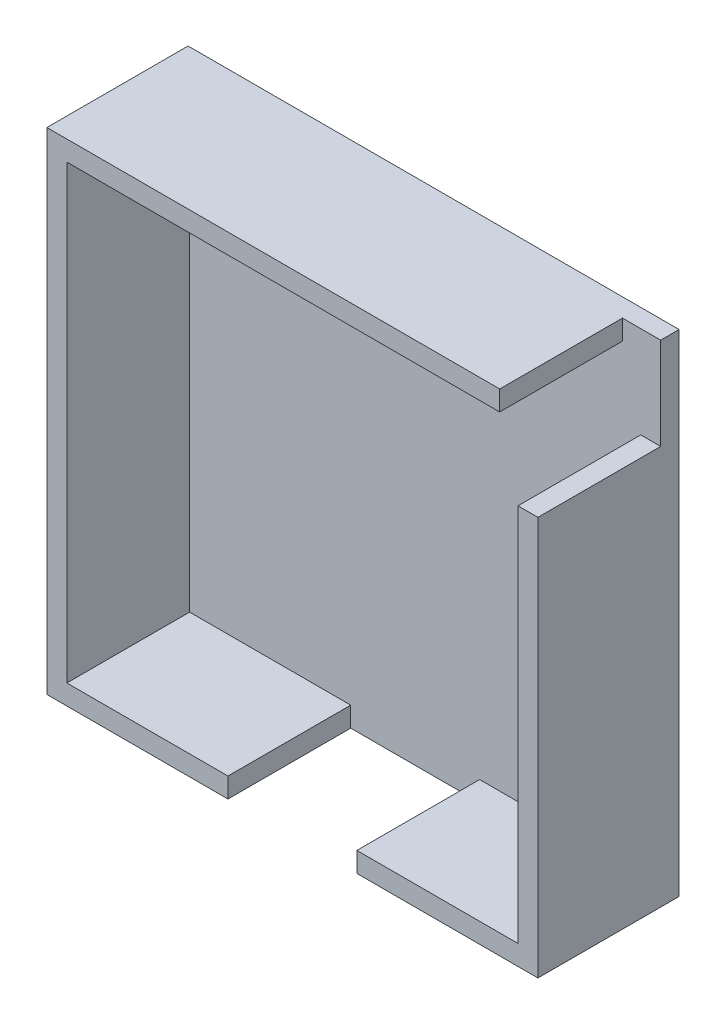
ISO-10303-21;
HEADER;
FILE_DESCRIPTION(('STEP AP214'),'2;1');
FILE_NAME('part.step','',(''),(''),'','','');
FILE_SCHEMA(('AUTOMOTIVE_DESIGN { 1 0 10303 214 1 1 1 1 }'));
ENDSEC;
DATA;
#1=APPLICATION_CONTEXT('core data for automotive mechanical design processes');
#2=APPLICATION_PROTOCOL_DEFINITION('international standard','automotive_design',2000,#1);
#3=PRODUCT_CONTEXT('',#1,'mechanical');
#4=PRODUCT('Part','Part','',(#3));
#5=PRODUCT_RELATED_PRODUCT_CATEGORY('part','',(#4));
#6=PRODUCT_DEFINITION_FORMATION('','',#4);
#7=PRODUCT_DEFINITION_CONTEXT('part definition',#1,'design');
#8=PRODUCT_DEFINITION('design','',#6,#7);
#9=PRODUCT_DEFINITION_SHAPE('','',#8);
#10=(LENGTH_UNIT() NAMED_UNIT(*) SI_UNIT(.MILLI.,.METRE.));
#11=(NAMED_UNIT(*) PLANE_ANGLE_UNIT() SI_UNIT($,.RADIAN.));
#12=(NAMED_UNIT(*) SI_UNIT($,.STERADIAN.) SOLID_ANGLE_UNIT());
#13=UNCERTAINTY_MEASURE_WITH_UNIT(LENGTH_MEASURE(1.E-05),#10,'distance_accuracy_value','');
#14=(GEOMETRIC_REPRESENTATION_CONTEXT(3) GLOBAL_UNCERTAINTY_ASSIGNED_CONTEXT((#13)) GLOBAL_UNIT_ASSIGNED_CONTEXT((#10,
#11,#12)) REPRESENTATION_CONTEXT('',''));
#15=CARTESIAN_POINT('',(0.,0.,0.));
#16=DIRECTION('',(0.,0.,1.));
#17=DIRECTION('',(1.,0.,0.));
#18=AXIS2_PLACEMENT_3D('',#15,#16,#17);
#19=CARTESIAN_POINT('',(0.,-40.,3.));
#20=DIRECTION('',(0.,-1.,0.));
#21=DIRECTION('',(1.,0.,0.));
#22=AXIS2_PLACEMENT_3D('',#19,#20,#21);
#23=PLANE('',#22);
#24=DIRECTION('',(-1.,0.,0.));
#25=VECTOR('',#24,1.);
#26=CARTESIAN_POINT('',(0.,-40.,0.));
#27=LINE('',#26,#25);
#28=CARTESIAN_POINT('',(40.,-40.,0.));
#29=VERTEX_POINT('',#28);
#30=CARTESIAN_POINT('',(-40.,-40.,0.));
#31=VERTEX_POINT('',#30);
#32=EDGE_CURVE('E268',#29,#31,#27,.T.);
#33=ORIENTED_EDGE('',*,*,#32,.F.);
#34=DIRECTION('',(0.,0.,-1.));
#35=VECTOR('',#34,1.);
#36=CARTESIAN_POINT('',(40.,-40.,3.));
#37=LINE('',#36,#35);
#38=CARTESIAN_POINT('',(40.,-40.,23.));
#39=VERTEX_POINT('',#38);
#40=EDGE_CURVE('E10',#39,#29,#37,.T.);
#41=ORIENTED_EDGE('',*,*,#40,.F.);
#42=DIRECTION('',(-1.,0.,0.));
#43=VECTOR('',#42,1.);
#44=CARTESIAN_POINT('',(0.,-40.,23.));
#45=LINE('',#44,#43);
#46=CARTESIAN_POINT('',(10.5,-40.,23.));
#47=VERTEX_POINT('',#46);
#48=EDGE_CURVE('E182',#39,#47,#45,.T.);
#49=ORIENTED_EDGE('',*,*,#48,.T.);
#50=DIRECTION('',(0.,0.,-1.));
#51=VECTOR('',#50,1.);
#52=CARTESIAN_POINT('',(10.5,-40.,23.));
#53=LINE('',#52,#51);
#54=CARTESIAN_POINT('',(10.5,-40.,3.));
#55=VERTEX_POINT('',#54);
#56=EDGE_CURVE('E167',#47,#55,#53,.T.);
#57=ORIENTED_EDGE('',*,*,#56,.T.);
#58=DIRECTION('',(-1.,0.,0.));
#59=VECTOR('',#58,1.);
#60=CARTESIAN_POINT('',(0.,-40.,3.));
#61=LINE('',#60,#59);
#62=CARTESIAN_POINT('',(-10.5,-40.,3.));
#63=VERTEX_POINT('',#62);
#64=EDGE_CURVE('E288',#55,#63,#61,.T.);
#65=ORIENTED_EDGE('',*,*,#64,.T.);
#66=DIRECTION('',(0.,0.,-1.));
#67=VECTOR('',#66,1.);
#68=CARTESIAN_POINT('',(-10.5,-40.,23.));
#69=LINE('',#68,#67);
#70=CARTESIAN_POINT('',(-10.5,-40.,23.));
#71=VERTEX_POINT('',#70);
#72=EDGE_CURVE('E281',#71,#63,#69,.T.);
#73=ORIENTED_EDGE('',*,*,#72,.F.);
#74=DIRECTION('',(-1.,0.,0.));
#75=VECTOR('',#74,1.);
#76=CARTESIAN_POINT('',(0.,-40.,23.));
#77=LINE('',#76,#75);
#78=CARTESIAN_POINT('',(-40.,-40.,23.));
#79=VERTEX_POINT('',#78);
#80=EDGE_CURVE('E220',#71,#79,#77,.T.);
#81=ORIENTED_EDGE('',*,*,#80,.T.);
#82=DIRECTION('',(0.,0.,-1.));
#83=VECTOR('',#82,1.);
#84=CARTESIAN_POINT('',(-40.,-40.,3.));
#85=LINE('',#84,#83);
#86=EDGE_CURVE('E298',#79,#31,#85,.T.);
#87=ORIENTED_EDGE('',*,*,#86,.T.);
#88=EDGE_LOOP('',(#33,#41,#49,#57,#65,#73,#81,#87));
#89=FACE_BOUND('',#88,.T.);
#90=ADVANCED_FACE('F16',(#89),#23,.T.);
#91=CARTESIAN_POINT('',(40.,-0.225990481713403,3.));
#92=DIRECTION('',(-1.,0.,0.));
#93=DIRECTION('',(0.,-1.,0.));
#94=AXIS2_PLACEMENT_3D('',#91,#92,#93);
#95=PLANE('',#94);
#96=DIRECTION('',(0.,1.,0.));
#97=VECTOR('',#96,1.);
#98=CARTESIAN_POINT('',(40.,-0.225990481713403,0.));
#99=LINE('',#98,#97);
#100=CARTESIAN_POINT('',(40.,40.,0.));
#101=VERTEX_POINT('',#100);
#102=EDGE_CURVE('E302',#29,#101,#99,.T.);
#103=ORIENTED_EDGE('',*,*,#102,.T.);
#104=DIRECTION('',(0.,0.,-1.));
#105=VECTOR('',#104,1.);
#106=CARTESIAN_POINT('',(40.,40.,3.));
#107=LINE('',#106,#105);
#108=CARTESIAN_POINT('',(40.,40.,3.));
#109=VERTEX_POINT('',#108);
#110=EDGE_CURVE('E24',#109,#101,#107,.T.);
#111=ORIENTED_EDGE('',*,*,#110,.F.);
#112=DIRECTION('',(0.,1.,0.));
#113=VECTOR('',#112,1.);
#114=CARTESIAN_POINT('',(40.,-0.225990481713403,3.));
#115=LINE('',#114,#113);
#116=CARTESIAN_POINT('',(40.,25.,3.));
#117=VERTEX_POINT('',#116);
#118=EDGE_CURVE('E291',#117,#109,#115,.T.);
#119=ORIENTED_EDGE('',*,*,#118,.F.);
#120=DIRECTION('',(0.,0.,-1.));
#121=VECTOR('',#120,1.);
#122=CARTESIAN_POINT('',(40.,25.,23.));
#123=LINE('',#122,#121);
#124=CARTESIAN_POINT('',(40.,25.,23.));
#125=VERTEX_POINT('',#124);
#126=EDGE_CURVE('E211',#125,#117,#123,.T.);
#127=ORIENTED_EDGE('',*,*,#126,.F.);
#128=DIRECTION('',(0.,1.,0.));
#129=VECTOR('',#128,1.);
#130=CARTESIAN_POINT('',(40.,-0.225990481713403,23.));
#131=LINE('',#130,#129);
#132=EDGE_CURVE('E187',#39,#125,#131,.T.);
#133=ORIENTED_EDGE('',*,*,#132,.F.);
#134=ORIENTED_EDGE('',*,*,#40,.T.);
#135=EDGE_LOOP('',(#103,#111,#119,#127,#133,#134));
#136=FACE_BOUND('',#135,.T.);
#137=ADVANCED_FACE('F347',(#136),#95,.F.);
#138=CARTESIAN_POINT('',(0.,40.,3.));
#139=DIRECTION('',(0.,-1.,0.));
#140=DIRECTION('',(1.,0.,0.));
#141=AXIS2_PLACEMENT_3D('',#138,#139,#140);
#142=PLANE('',#141);
#143=DIRECTION('',(-1.,0.,0.));
#144=VECTOR('',#143,1.);
#145=CARTESIAN_POINT('',(0.,40.,0.));
#146=LINE('',#145,#144);
#147=CARTESIAN_POINT('',(-40.,40.,0.));
#148=VERTEX_POINT('',#147);
#149=EDGE_CURVE('E305',#101,#148,#146,.T.);
#150=ORIENTED_EDGE('',*,*,#149,.T.);
#151=DIRECTION('',(0.,0.,-1.));
#152=VECTOR('',#151,1.);
#153=CARTESIAN_POINT('',(-40.,40.,3.));
#154=LINE('',#153,#152);
#155=CARTESIAN_POINT('',(-40.,40.,23.));
#156=VERTEX_POINT('',#155);
#157=EDGE_CURVE('E314',#156,#148,#154,.T.);
#158=ORIENTED_EDGE('',*,*,#157,.F.);
#159=DIRECTION('',(-1.,0.,0.));
#160=VECTOR('',#159,1.);
#161=CARTESIAN_POINT('',(0.,40.,23.));
#162=LINE('',#161,#160);
#163=CARTESIAN_POINT('',(33.7766595184803,40.,23.));
#164=VERTEX_POINT('',#163);
#165=EDGE_CURVE('E226',#164,#156,#162,.T.);
#166=ORIENTED_EDGE('',*,*,#165,.F.);
#167=DIRECTION('',(0.,0.,-1.));
#168=VECTOR('',#167,1.);
#169=CARTESIAN_POINT('',(33.7766595184803,40.,23.));
#170=LINE('',#169,#168);
#171=CARTESIAN_POINT('',(33.7766595184803,40.,3.));
#172=VERTEX_POINT('',#171);
#173=EDGE_CURVE('E277',#164,#172,#170,.T.);
#174=ORIENTED_EDGE('',*,*,#173,.T.);
#175=DIRECTION('',(-1.,0.,0.));
#176=VECTOR('',#175,1.);
#177=CARTESIAN_POINT('',(0.,40.,3.));
#178=LINE('',#177,#176);
#179=EDGE_CURVE('E295',#109,#172,#178,.T.);
#180=ORIENTED_EDGE('',*,*,#179,.F.);
#181=ORIENTED_EDGE('',*,*,#110,.T.);
#182=EDGE_LOOP('',(#150,#158,#166,#174,#180,#181));
#183=FACE_BOUND('',#182,.T.);
#184=ADVANCED_FACE('F323',(#183),#142,.F.);
#185=CARTESIAN_POINT('',(-40.,-0.225990481713413,3.));
#186=DIRECTION('',(-1.,0.,0.));
#187=DIRECTION('',(0.,-1.,0.));
#188=AXIS2_PLACEMENT_3D('',#185,#186,#187);
#189=PLANE('',#188);
#190=DIRECTION('',(0.,1.,0.));
#191=VECTOR('',#190,1.);
#192=CARTESIAN_POINT('',(-40.,-0.225990481713413,0.));
#193=LINE('',#192,#191);
#194=EDGE_CURVE('E292',#31,#148,#193,.T.);
#195=ORIENTED_EDGE('',*,*,#194,.F.);
#196=ORIENTED_EDGE('',*,*,#86,.F.);
#197=DIRECTION('',(0.,1.,0.));
#198=VECTOR('',#197,1.);
#199=CARTESIAN_POINT('',(-40.,-0.225990481713413,23.));
#200=LINE('',#199,#198);
#201=EDGE_CURVE('E222',#79,#156,#200,.T.);
#202=ORIENTED_EDGE('',*,*,#201,.T.);
#203=ORIENTED_EDGE('',*,*,#157,.T.);
#204=EDGE_LOOP('',(#195,#196,#202,#203));
#205=FACE_BOUND('',#204,.T.);
#206=ADVANCED_FACE('F332',(#205),#189,.T.);
#207=CARTESIAN_POINT('',(0.,0.,3.));
#208=DIRECTION('',(0.,0.,1.));
#209=DIRECTION('',(1.,0.,0.));
#210=AXIS2_PLACEMENT_3D('',#207,#208,#209);
#211=PLANE('',#210);
#212=DIRECTION('',(-1.,0.,0.));
#213=VECTOR('',#212,1.);
#214=CARTESIAN_POINT('',(36.8883297592402,25.,3.));
#215=LINE('',#214,#213);
#216=CARTESIAN_POINT('',(36.75,25.,3.));
#217=VERTEX_POINT('',#216);
#218=EDGE_CURVE('E201',#117,#217,#215,.T.);
#219=ORIENTED_EDGE('',*,*,#218,.F.);
#220=ORIENTED_EDGE('',*,*,#118,.T.);
#221=ORIENTED_EDGE('',*,*,#179,.T.);
#222=DIRECTION('',(0.,-1.,0.));
#223=VECTOR('',#222,1.);
#224=CARTESIAN_POINT('',(33.7766595184803,33.8033168390393,3.));
#225=LINE('',#224,#223);
#226=CARTESIAN_POINT('',(33.7766595184803,36.75,3.));
#227=VERTEX_POINT('',#226);
#228=EDGE_CURVE('E251',#172,#227,#225,.T.);
#229=ORIENTED_EDGE('',*,*,#228,.T.);
#230=DIRECTION('',(1.,0.,0.));
#231=VECTOR('',#230,1.);
#232=CARTESIAN_POINT('',(0.,36.75,3.));
#233=LINE('',#232,#231);
#234=CARTESIAN_POINT('',(-36.75,36.75,3.));
#235=VERTEX_POINT('',#234);
#236=EDGE_CURVE('E254',#235,#227,#233,.T.);
#237=ORIENTED_EDGE('',*,*,#236,.F.);
#238=DIRECTION('',(0.,1.,0.));
#239=VECTOR('',#238,1.);
#240=CARTESIAN_POINT('',(-36.75,-2.72999827521185,3.));
#241=LINE('',#240,#239);
#242=CARTESIAN_POINT('',(-36.75,-36.75,3.));
#243=VERTEX_POINT('',#242);
#244=EDGE_CURVE('E258',#243,#235,#241,.T.);
#245=ORIENTED_EDGE('',*,*,#244,.F.);
#246=DIRECTION('',(1.,0.,0.));
#247=VECTOR('',#246,1.);
#248=CARTESIAN_POINT('',(0.,-36.75,3.));
#249=LINE('',#248,#247);
#250=CARTESIAN_POINT('',(-10.5,-36.75,3.));
#251=VERTEX_POINT('',#250);
#252=EDGE_CURVE('E221',#243,#251,#249,.T.);
#253=ORIENTED_EDGE('',*,*,#252,.T.);
#254=DIRECTION('',(0.,1.,0.));
#255=VECTOR('',#254,1.);
#256=CARTESIAN_POINT('',(-10.5,-36.75,3.));
#257=LINE('',#256,#255);
#258=EDGE_CURVE('E166',#63,#251,#257,.T.);
#259=ORIENTED_EDGE('',*,*,#258,.F.);
#260=ORIENTED_EDGE('',*,*,#64,.F.);
#261=DIRECTION('',(0.,1.,0.));
#262=VECTOR('',#261,1.);
#263=CARTESIAN_POINT('',(10.5,-36.75,3.));
#264=LINE('',#263,#262);
#265=CARTESIAN_POINT('',(10.5,-36.75,3.));
#266=VERTEX_POINT('',#265);
#267=EDGE_CURVE('E36',#55,#266,#264,.T.);
#268=ORIENTED_EDGE('',*,*,#267,.T.);
#269=DIRECTION('',(1.,0.,0.));
#270=VECTOR('',#269,1.);
#271=CARTESIAN_POINT('',(0.,-36.75,3.));
#272=LINE('',#271,#270);
#273=CARTESIAN_POINT('',(36.75,-36.75,3.));
#274=VERTEX_POINT('',#273);
#275=EDGE_CURVE('E162',#266,#274,#272,.T.);
#276=ORIENTED_EDGE('',*,*,#275,.T.);
#277=DIRECTION('',(0.,1.,0.));
#278=VECTOR('',#277,1.);
#279=CARTESIAN_POINT('',(36.75,-2.72999827521185,3.));
#280=LINE('',#279,#278);
#281=EDGE_CURVE('E44',#274,#217,#280,.T.);
#282=ORIENTED_EDGE('',*,*,#281,.T.);
#283=EDGE_LOOP('',(#219,#220,#221,#229,#237,#245,#253,#259,#260,#268,#276,#282));
#284=FACE_BOUND('',#283,.T.);
#285=ADVANCED_FACE('F345',(#284),#211,.T.);
#286=CARTESIAN_POINT('',(0.,0.,0.));
#287=DIRECTION('',(0.,0.,1.));
#288=DIRECTION('',(1.,0.,0.));
#289=AXIS2_PLACEMENT_3D('',#286,#287,#288);
#290=PLANE('',#289);
#291=ORIENTED_EDGE('',*,*,#32,.T.);
#292=ORIENTED_EDGE('',*,*,#194,.T.);
#293=ORIENTED_EDGE('',*,*,#149,.F.);
#294=ORIENTED_EDGE('',*,*,#102,.F.);
#295=EDGE_LOOP('',(#291,#292,#293,#294));
#296=FACE_BOUND('',#295,.T.);
#297=ADVANCED_FACE('F328',(#296),#290,.F.);
#298=CARTESIAN_POINT('',(0.,-36.75,23.));
#299=DIRECTION('',(0.,1.,0.));
#300=DIRECTION('',(0.,0.,1.));
#301=AXIS2_PLACEMENT_3D('',#298,#299,#300);
#302=PLANE('',#301);
#303=ORIENTED_EDGE('',*,*,#252,.F.);
#304=DIRECTION('',(0.,0.,-1.));
#305=VECTOR('',#304,1.);
#306=CARTESIAN_POINT('',(-36.75,-36.75,23.));
#307=LINE('',#306,#305);
#308=CARTESIAN_POINT('',(-36.75,-36.75,23.));
#309=VERTEX_POINT('',#308);
#310=EDGE_CURVE('E264',#309,#243,#307,.T.);
#311=ORIENTED_EDGE('',*,*,#310,.F.);
#312=DIRECTION('',(1.,0.,0.));
#313=VECTOR('',#312,1.);
#314=CARTESIAN_POINT('',(0.,-36.75,23.));
#315=LINE('',#314,#313);
#316=CARTESIAN_POINT('',(-10.5,-36.75,23.));
#317=VERTEX_POINT('',#316);
#318=EDGE_CURVE('E240',#309,#317,#315,.T.);
#319=ORIENTED_EDGE('',*,*,#318,.T.);
#320=DIRECTION('',(0.,0.,-1.));
#321=VECTOR('',#320,1.);
#322=CARTESIAN_POINT('',(-10.5,-36.75,23.));
#323=LINE('',#322,#321);
#324=EDGE_CURVE('E247',#317,#251,#323,.T.);
#325=ORIENTED_EDGE('',*,*,#324,.T.);
#326=EDGE_LOOP('',(#303,#311,#319,#325));
#327=FACE_BOUND('',#326,.T.);
#328=ADVANCED_FACE('F361',(#327),#302,.T.);
#329=CARTESIAN_POINT('',(-36.75,-2.72999827521185,23.));
#330=DIRECTION('',(-1.,0.,0.));
#331=DIRECTION('',(0.,-1.,0.));
#332=AXIS2_PLACEMENT_3D('',#329,#330,#331);
#333=PLANE('',#332);
#334=ORIENTED_EDGE('',*,*,#244,.T.);
#335=DIRECTION('',(0.,0.,-1.));
#336=VECTOR('',#335,1.);
#337=CARTESIAN_POINT('',(-36.75,36.75,23.));
#338=LINE('',#337,#336);
#339=CARTESIAN_POINT('',(-36.75,36.75,23.));
#340=VERTEX_POINT('',#339);
#341=EDGE_CURVE('E269',#340,#235,#338,.T.);
#342=ORIENTED_EDGE('',*,*,#341,.F.);
#343=DIRECTION('',(0.,1.,0.));
#344=VECTOR('',#343,1.);
#345=CARTESIAN_POINT('',(-36.75,-2.72999827521185,23.));
#346=LINE('',#345,#344);
#347=EDGE_CURVE('E237',#309,#340,#346,.T.);
#348=ORIENTED_EDGE('',*,*,#347,.F.);
#349=ORIENTED_EDGE('',*,*,#310,.T.);
#350=EDGE_LOOP('',(#334,#342,#348,#349));
#351=FACE_BOUND('',#350,.T.);
#352=ADVANCED_FACE('F365',(#351),#333,.F.);
#353=CARTESIAN_POINT('',(0.,36.75,23.));
#354=DIRECTION('',(0.,1.,0.));
#355=DIRECTION('',(0.,0.,1.));
#356=AXIS2_PLACEMENT_3D('',#353,#354,#355);
#357=PLANE('',#356);
#358=ORIENTED_EDGE('',*,*,#236,.T.);
#359=DIRECTION('',(0.,0.,-1.));
#360=VECTOR('',#359,1.);
#361=CARTESIAN_POINT('',(33.7766595184803,36.75,23.));
#362=LINE('',#361,#360);
#363=CARTESIAN_POINT('',(33.7766595184803,36.75,23.));
#364=VERTEX_POINT('',#363);
#365=EDGE_CURVE('E273',#364,#227,#362,.T.);
#366=ORIENTED_EDGE('',*,*,#365,.F.);
#367=DIRECTION('',(1.,0.,0.));
#368=VECTOR('',#367,1.);
#369=CARTESIAN_POINT('',(0.,36.75,23.));
#370=LINE('',#369,#368);
#371=EDGE_CURVE('E234',#340,#364,#370,.T.);
#372=ORIENTED_EDGE('',*,*,#371,.F.);
#373=ORIENTED_EDGE('',*,*,#341,.T.);
#374=EDGE_LOOP('',(#358,#366,#372,#373));
#375=FACE_BOUND('',#374,.T.);
#376=ADVANCED_FACE('F367',(#375),#357,.F.);
#377=CARTESIAN_POINT('',(33.7766595184803,33.8033168390393,23.));
#378=DIRECTION('',(1.,0.,0.));
#379=DIRECTION('',(0.,1.,0.));
#380=AXIS2_PLACEMENT_3D('',#377,#378,#379);
#381=PLANE('',#380);
#382=ORIENTED_EDGE('',*,*,#228,.F.);
#383=ORIENTED_EDGE('',*,*,#173,.F.);
#384=DIRECTION('',(0.,-1.,0.));
#385=VECTOR('',#384,1.);
#386=CARTESIAN_POINT('',(33.7766595184803,33.8033168390393,23.));
#387=LINE('',#386,#385);
#388=EDGE_CURVE('E230',#164,#364,#387,.T.);
#389=ORIENTED_EDGE('',*,*,#388,.T.);
#390=ORIENTED_EDGE('',*,*,#365,.T.);
#391=EDGE_LOOP('',(#382,#383,#389,#390));
#392=FACE_BOUND('',#391,.T.);
#393=ADVANCED_FACE('F344',(#392),#381,.T.);
#394=CARTESIAN_POINT('',(-10.5,-36.75,23.));
#395=DIRECTION('',(-1.,0.,0.));
#396=DIRECTION('',(0.,-1.,0.));
#397=AXIS2_PLACEMENT_3D('',#394,#395,#396);
#398=PLANE('',#397);
#399=ORIENTED_EDGE('',*,*,#258,.T.);
#400=ORIENTED_EDGE('',*,*,#324,.F.);
#401=DIRECTION('',(0.,1.,0.));
#402=VECTOR('',#401,1.);
#403=CARTESIAN_POINT('',(-10.5,-36.75,23.));
#404=LINE('',#403,#402);
#405=EDGE_CURVE('E217',#71,#317,#404,.T.);
#406=ORIENTED_EDGE('',*,*,#405,.F.);
#407=ORIENTED_EDGE('',*,*,#72,.T.);
#408=EDGE_LOOP('',(#399,#400,#406,#407));
#409=FACE_BOUND('',#408,.T.);
#410=ADVANCED_FACE('F357',(#409),#398,.F.);
#411=CARTESIAN_POINT('',(0.,0.,23.));
#412=DIRECTION('',(0.,0.,1.));
#413=DIRECTION('',(1.,0.,0.));
#414=AXIS2_PLACEMENT_3D('',#411,#412,#413);
#415=PLANE('',#414);
#416=ORIENTED_EDGE('',*,*,#318,.F.);
#417=ORIENTED_EDGE('',*,*,#347,.T.);
#418=ORIENTED_EDGE('',*,*,#371,.T.);
#419=ORIENTED_EDGE('',*,*,#388,.F.);
#420=ORIENTED_EDGE('',*,*,#165,.T.);
#421=ORIENTED_EDGE('',*,*,#201,.F.);
#422=ORIENTED_EDGE('',*,*,#80,.F.);
#423=ORIENTED_EDGE('',*,*,#405,.T.);
#424=EDGE_LOOP('',(#416,#417,#418,#419,#420,#421,#422,#423));
#425=FACE_BOUND('',#424,.T.);
#426=ADVANCED_FACE('F338',(#425),#415,.T.);
#427=CARTESIAN_POINT('',(0.,-36.75,23.));
#428=DIRECTION('',(0.,1.,0.));
#429=DIRECTION('',(0.,0.,1.));
#430=AXIS2_PLACEMENT_3D('',#427,#428,#429);
#431=PLANE('',#430);
#432=ORIENTED_EDGE('',*,*,#275,.F.);
#433=DIRECTION('',(0.,0.,-1.));
#434=VECTOR('',#433,1.);
#435=CARTESIAN_POINT('',(10.5,-36.75,23.));
#436=LINE('',#435,#434);
#437=CARTESIAN_POINT('',(10.5,-36.75,23.));
#438=VERTEX_POINT('',#437);
#439=EDGE_CURVE('E156',#438,#266,#436,.T.);
#440=ORIENTED_EDGE('',*,*,#439,.F.);
#441=DIRECTION('',(1.,0.,0.));
#442=VECTOR('',#441,1.);
#443=CARTESIAN_POINT('',(0.,-36.75,23.));
#444=LINE('',#443,#442);
#445=CARTESIAN_POINT('',(36.75,-36.75,23.));
#446=VERTEX_POINT('',#445);
#447=EDGE_CURVE('E160',#438,#446,#444,.T.);
#448=ORIENTED_EDGE('',*,*,#447,.T.);
#449=DIRECTION('',(0.,0.,-1.));
#450=VECTOR('',#449,1.);
#451=CARTESIAN_POINT('',(36.75,-36.75,23.));
#452=LINE('',#451,#450);
#453=EDGE_CURVE('E196',#446,#274,#452,.T.);
#454=ORIENTED_EDGE('',*,*,#453,.T.);
#455=EDGE_LOOP('',(#432,#440,#448,#454));
#456=FACE_BOUND('',#455,.T.);
#457=ADVANCED_FACE('F158',(#456),#431,.T.);
#458=CARTESIAN_POINT('',(10.5,-36.75,23.));
#459=DIRECTION('',(-1.,0.,0.));
#460=DIRECTION('',(0.,-1.,0.));
#461=AXIS2_PLACEMENT_3D('',#458,#459,#460);
#462=PLANE('',#461);
#463=ORIENTED_EDGE('',*,*,#267,.F.);
#464=ORIENTED_EDGE('',*,*,#56,.F.);
#465=DIRECTION('',(0.,1.,0.));
#466=VECTOR('',#465,1.);
#467=CARTESIAN_POINT('',(10.5,-36.75,23.));
#468=LINE('',#467,#466);
#469=EDGE_CURVE('E173',#47,#438,#468,.T.);
#470=ORIENTED_EDGE('',*,*,#469,.T.);
#471=ORIENTED_EDGE('',*,*,#439,.T.);
#472=EDGE_LOOP('',(#463,#464,#470,#471));
#473=FACE_BOUND('',#472,.T.);
#474=ADVANCED_FACE('F179',(#473),#462,.T.);
#475=CARTESIAN_POINT('',(36.8883297592402,25.,23.));
#476=DIRECTION('',(0.,-1.,0.));
#477=DIRECTION('',(1.,0.,0.));
#478=AXIS2_PLACEMENT_3D('',#475,#476,#477);
#479=PLANE('',#478);
#480=ORIENTED_EDGE('',*,*,#218,.T.);
#481=DIRECTION('',(0.,0.,-1.));
#482=VECTOR('',#481,1.);
#483=CARTESIAN_POINT('',(36.75,25.,23.));
#484=LINE('',#483,#482);
#485=CARTESIAN_POINT('',(36.75,25.,23.));
#486=VERTEX_POINT('',#485);
#487=EDGE_CURVE('E208',#486,#217,#484,.T.);
#488=ORIENTED_EDGE('',*,*,#487,.F.);
#489=DIRECTION('',(-1.,0.,0.));
#490=VECTOR('',#489,1.);
#491=CARTESIAN_POINT('',(36.8883297592402,25.,23.));
#492=LINE('',#491,#490);
#493=EDGE_CURVE('E192',#125,#486,#492,.T.);
#494=ORIENTED_EDGE('',*,*,#493,.F.);
#495=ORIENTED_EDGE('',*,*,#126,.T.);
#496=EDGE_LOOP('',(#480,#488,#494,#495));
#497=FACE_BOUND('',#496,.T.);
#498=ADVANCED_FACE('F351',(#497),#479,.F.);
#499=CARTESIAN_POINT('',(36.75,-2.72999827521185,23.));
#500=DIRECTION('',(-1.,0.,0.));
#501=DIRECTION('',(0.,-1.,0.));
#502=AXIS2_PLACEMENT_3D('',#499,#500,#501);
#503=PLANE('',#502);
#504=ORIENTED_EDGE('',*,*,#281,.F.);
#505=ORIENTED_EDGE('',*,*,#453,.F.);
#506=DIRECTION('',(0.,1.,0.));
#507=VECTOR('',#506,1.);
#508=CARTESIAN_POINT('',(36.75,-2.72999827521185,23.));
#509=LINE('',#508,#507);
#510=EDGE_CURVE('E176',#446,#486,#509,.T.);
#511=ORIENTED_EDGE('',*,*,#510,.T.);
#512=ORIENTED_EDGE('',*,*,#487,.T.);
#513=EDGE_LOOP('',(#504,#505,#511,#512));
#514=FACE_BOUND('',#513,.T.);
#515=ADVANCED_FACE('F480',(#514),#503,.T.);
#516=CARTESIAN_POINT('',(0.,0.,23.));
#517=DIRECTION('',(0.,0.,1.));
#518=DIRECTION('',(1.,0.,0.));
#519=AXIS2_PLACEMENT_3D('',#516,#517,#518);
#520=PLANE('',#519);
#521=ORIENTED_EDGE('',*,*,#447,.F.);
#522=ORIENTED_EDGE('',*,*,#469,.F.);
#523=ORIENTED_EDGE('',*,*,#48,.F.);
#524=ORIENTED_EDGE('',*,*,#132,.T.);
#525=ORIENTED_EDGE('',*,*,#493,.T.);
#526=ORIENTED_EDGE('',*,*,#510,.F.);
#527=EDGE_LOOP('',(#521,#522,#523,#524,#525,#526));
#528=FACE_BOUND('',#527,.T.);
#529=ADVANCED_FACE('F171',(#528),#520,.T.);
#530=CLOSED_SHELL('',(#90,#137,#184,#206,#285,#297,#328,#352,#376,#393,#410,#426,#457,#474,#498,
#515,#529));
#531=MANIFOLD_SOLID_BREP('B1',#530);
#532=ADVANCED_BREP_SHAPE_REPRESENTATION('',(#18,#531),#14);
#533=SHAPE_DEFINITION_REPRESENTATION(#9,#532);
ENDSEC;
END-ISO-10303-21;
